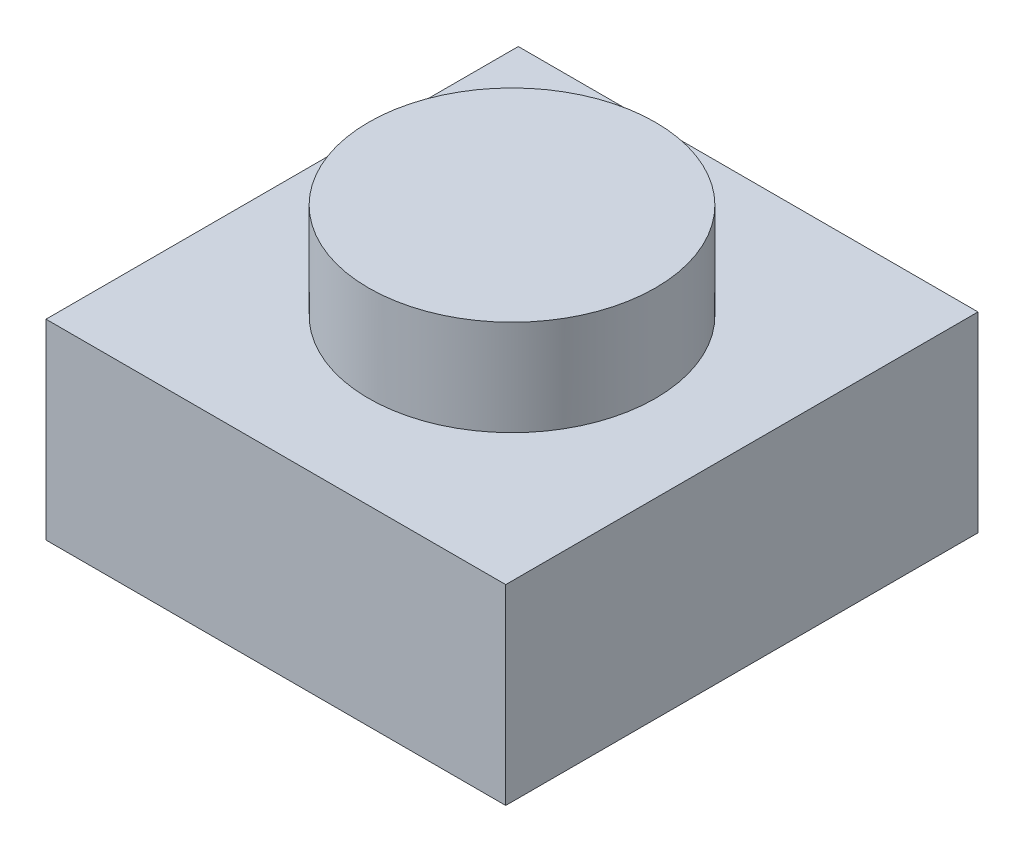
ISO-10303-21;
HEADER;
FILE_DESCRIPTION(('STEP AP214'),'2;1');
FILE_NAME('part.step','',(''),(''),'','','');
FILE_SCHEMA(('AUTOMOTIVE_DESIGN { 1 0 10303 214 1 1 1 1 }'));
ENDSEC;
DATA;
#1=APPLICATION_CONTEXT('core data for automotive mechanical design processes');
#2=APPLICATION_PROTOCOL_DEFINITION('international standard','automotive_design',2000,#1);
#3=PRODUCT_CONTEXT('',#1,'mechanical');
#4=PRODUCT('Part','Part','',(#3));
#5=PRODUCT_RELATED_PRODUCT_CATEGORY('part','',(#4));
#6=PRODUCT_DEFINITION_FORMATION('','',#4);
#7=PRODUCT_DEFINITION_CONTEXT('part definition',#1,'design');
#8=PRODUCT_DEFINITION('design','',#6,#7);
#9=PRODUCT_DEFINITION_SHAPE('','',#8);
#10=(LENGTH_UNIT() NAMED_UNIT(*) SI_UNIT(.MILLI.,.METRE.));
#11=(NAMED_UNIT(*) PLANE_ANGLE_UNIT() SI_UNIT($,.RADIAN.));
#12=(NAMED_UNIT(*) SI_UNIT($,.STERADIAN.) SOLID_ANGLE_UNIT());
#13=UNCERTAINTY_MEASURE_WITH_UNIT(LENGTH_MEASURE(1.E-05),#10,'distance_accuracy_value','');
#14=(GEOMETRIC_REPRESENTATION_CONTEXT(3) GLOBAL_UNCERTAINTY_ASSIGNED_CONTEXT((#13)) GLOBAL_UNIT_ASSIGNED_CONTEXT((#10,
#11,#12)) REPRESENTATION_CONTEXT('',''));
#15=CARTESIAN_POINT('',(0.,0.,0.));
#16=DIRECTION('',(0.,0.,1.));
#17=DIRECTION('',(1.,0.,0.));
#18=AXIS2_PLACEMENT_3D('',#15,#16,#17);
#19=CARTESIAN_POINT('',(0.,0.,6.7));
#20=DIRECTION('',(0.,0.,1.));
#21=DIRECTION('',(1.,0.,0.));
#22=AXIS2_PLACEMENT_3D('',#19,#20,#21);
#23=PLANE('',#22);
#24=DIRECTION('',(0.,1.,0.));
#25=VECTOR('',#24,1.);
#26=CARTESIAN_POINT('',(1.99527093596059,0.,6.7));
#27=LINE('',#26,#25);
#28=CARTESIAN_POINT('',(1.99527093596059,0.,6.7));
#29=VERTEX_POINT('',#28);
#30=CARTESIAN_POINT('',(1.99527093596058,2.,6.7));
#31=VERTEX_POINT('',#30);
#32=EDGE_CURVE('E171',#29,#31,#27,.T.);
#33=ORIENTED_EDGE('',*,*,#32,.F.);
#34=DIRECTION('',(-1.,0.,0.));
#35=VECTOR('',#34,1.);
#36=CARTESIAN_POINT('',(0.,0.,6.7));
#37=LINE('',#36,#35);
#38=CARTESIAN_POINT('',(-3.24570946774915,0.,6.7));
#39=VERTEX_POINT('',#38);
#40=EDGE_CURVE('E64',#29,#39,#37,.T.);
#41=ORIENTED_EDGE('',*,*,#40,.T.);
#42=DIRECTION('',(0.,-1.,0.));
#43=VECTOR('',#42,1.);
#44=CARTESIAN_POINT('',(-3.24570946774915,2.,6.7));
#45=LINE('',#44,#43);
#46=CARTESIAN_POINT('',(-3.24570946774915,2.,6.7));
#47=VERTEX_POINT('',#46);
#48=EDGE_CURVE('E160',#47,#39,#45,.T.);
#49=ORIENTED_EDGE('',*,*,#48,.F.);
#50=DIRECTION('',(-1.,0.,0.));
#51=VECTOR('',#50,1.);
#52=CARTESIAN_POINT('',(2.89527093596059,2.,6.7));
#53=LINE('',#52,#51);
#54=EDGE_CURVE('E136',#31,#47,#53,.T.);
#55=ORIENTED_EDGE('',*,*,#54,.F.);
#56=EDGE_LOOP('',(#33,#41,#49,#55));
#57=FACE_BOUND('',#56,.T.);
#58=ADVANCED_FACE('F42',(#57),#23,.F.);
#59=CARTESIAN_POINT('',(-12.4847290640394,0.,1.2));
#60=DIRECTION('',(0.,0.,1.));
#61=DIRECTION('',(1.,0.,0.));
#62=AXIS2_PLACEMENT_3D('',#59,#60,#61);
#63=PLANE('',#62);
#64=DIRECTION('',(-1.,0.,0.));
#65=VECTOR('',#64,1.);
#66=CARTESIAN_POINT('',(-12.4847290640394,0.,1.2));
#67=LINE('',#66,#65);
#68=CARTESIAN_POINT('',(1.99527093596059,0.,1.2));
#69=VERTEX_POINT('',#68);
#70=CARTESIAN_POINT('',(-3.24570946774915,0.,1.2));
#71=VERTEX_POINT('',#70);
#72=EDGE_CURVE('E111',#69,#71,#67,.T.);
#73=ORIENTED_EDGE('',*,*,#72,.F.);
#74=DIRECTION('',(0.,1.,0.));
#75=VECTOR('',#74,1.);
#76=CARTESIAN_POINT('',(1.99527093596059,0.,1.2));
#77=LINE('',#76,#75);
#78=CARTESIAN_POINT('',(1.99527093596059,2.,1.2));
#79=VERTEX_POINT('',#78);
#80=EDGE_CURVE('E167',#69,#79,#77,.T.);
#81=ORIENTED_EDGE('',*,*,#80,.T.);
#82=DIRECTION('',(1.,0.,0.));
#83=VECTOR('',#82,1.);
#84=CARTESIAN_POINT('',(-12.4847290640394,2.,1.2));
#85=LINE('',#84,#83);
#86=CARTESIAN_POINT('',(-3.24570946774915,2.,1.2));
#87=VERTEX_POINT('',#86);
#88=EDGE_CURVE('E128',#87,#79,#85,.T.);
#89=ORIENTED_EDGE('',*,*,#88,.F.);
#90=DIRECTION('',(0.,-1.,0.));
#91=VECTOR('',#90,1.);
#92=CARTESIAN_POINT('',(-3.24570946774915,2.,1.2));
#93=LINE('',#92,#91);
#94=EDGE_CURVE('E164',#87,#71,#93,.T.);
#95=ORIENTED_EDGE('',*,*,#94,.T.);
#96=EDGE_LOOP('',(#73,#81,#89,#95));
#97=FACE_BOUND('',#96,.T.);
#98=ADVANCED_FACE('F151',(#97),#63,.T.);
#99=CARTESIAN_POINT('',(2.89527093596059,3.2,7.9));
#100=DIRECTION('',(0.,-1.,0.));
#101=DIRECTION('',(1.,0.,0.));
#102=AXIS2_PLACEMENT_3D('',#99,#100,#101);
#103=PLANE('',#102);
#104=CARTESIAN_POINT('',(-0.614730354205517,3.2,3.95));
#105=DIRECTION('',(0.,-1.,0.));
#106=DIRECTION('',(1.,0.,0.));
#107=AXIS2_PLACEMENT_3D('',#104,#105,#106);
#108=CIRCLE('',#107,2.4);
#109=CARTESIAN_POINT('',(1.78526964579448,3.2,3.95));
#110=VERTEX_POINT('',#109);
#111=EDGE_CURVE('E50',#110,#110,#108,.F.);
#112=ORIENTED_EDGE('',*,*,#111,.F.);
#113=EDGE_LOOP('',(#112));
#114=FACE_BOUND('',#113,.T.);
#115=DIRECTION('',(1.,0.,0.));
#116=VECTOR('',#115,1.);
#117=CARTESIAN_POINT('',(-12.4847290640394,3.2,0.));
#118=LINE('',#117,#116);
#119=CARTESIAN_POINT('',(-4.45973164437162,3.2,0.));
#120=VERTEX_POINT('',#119);
#121=CARTESIAN_POINT('',(3.23027093596058,3.2,0.));
#122=VERTEX_POINT('',#121);
#123=EDGE_CURVE('E139',#120,#122,#118,.T.);
#124=ORIENTED_EDGE('',*,*,#123,.F.);
#125=DIRECTION('',(0.,0.,1.));
#126=VECTOR('',#125,1.);
#127=CARTESIAN_POINT('',(-4.45973164437162,3.2,0.));
#128=LINE('',#127,#126);
#129=CARTESIAN_POINT('',(-4.45973164437162,3.2,7.9));
#130=VERTEX_POINT('',#129);
#131=EDGE_CURVE('E124',#120,#130,#128,.T.);
#132=ORIENTED_EDGE('',*,*,#131,.T.);
#133=DIRECTION('',(-1.,0.,0.));
#134=VECTOR('',#133,1.);
#135=CARTESIAN_POINT('',(2.89527093596059,3.2,7.9));
#136=LINE('',#135,#134);
#137=CARTESIAN_POINT('',(3.23027093596058,3.2,7.9));
#138=VERTEX_POINT('',#137);
#139=EDGE_CURVE('E141',#138,#130,#136,.T.);
#140=ORIENTED_EDGE('',*,*,#139,.F.);
#141=DIRECTION('',(0.,0.,-1.));
#142=VECTOR('',#141,1.);
#143=CARTESIAN_POINT('',(3.23027093596058,3.2,7.9));
#144=LINE('',#143,#142);
#145=EDGE_CURVE('E155',#138,#122,#144,.T.);
#146=ORIENTED_EDGE('',*,*,#145,.T.);
#147=EDGE_LOOP('',(#124,#132,#140,#146));
#148=FACE_BOUND('',#147,.T.);
#149=ADVANCED_FACE('F44',(#114,#148),#103,.F.);
#150=CARTESIAN_POINT('',(0.,0.,7.9));
#151=DIRECTION('',(0.,0.,1.));
#152=DIRECTION('',(1.,0.,0.));
#153=AXIS2_PLACEMENT_3D('',#150,#151,#152);
#154=PLANE('',#153);
#155=DIRECTION('',(-1.,0.,0.));
#156=VECTOR('',#155,1.);
#157=CARTESIAN_POINT('',(-4.45973164437162,0.,7.9));
#158=LINE('',#157,#156);
#159=CARTESIAN_POINT('',(3.23027093596058,0.,7.9));
#160=VERTEX_POINT('',#159);
#161=CARTESIAN_POINT('',(-4.45973164437162,0.,7.9));
#162=VERTEX_POINT('',#161);
#163=EDGE_CURVE('E107',#160,#162,#158,.T.);
#164=ORIENTED_EDGE('',*,*,#163,.F.);
#165=DIRECTION('',(0.,1.,0.));
#166=VECTOR('',#165,1.);
#167=CARTESIAN_POINT('',(3.23027093596058,3.2,7.9));
#168=LINE('',#167,#166);
#169=EDGE_CURVE('E158',#160,#138,#168,.T.);
#170=ORIENTED_EDGE('',*,*,#169,.T.);
#171=ORIENTED_EDGE('',*,*,#139,.T.);
#172=DIRECTION('',(0.,1.,0.));
#173=VECTOR('',#172,1.);
#174=CARTESIAN_POINT('',(-4.45973164437162,3.2,7.9));
#175=LINE('',#174,#173);
#176=EDGE_CURVE('E126',#162,#130,#175,.T.);
#177=ORIENTED_EDGE('',*,*,#176,.F.);
#178=EDGE_LOOP('',(#164,#170,#171,#177));
#179=FACE_BOUND('',#178,.T.);
#180=ADVANCED_FACE('F150',(#179),#154,.T.);
#181=CARTESIAN_POINT('',(-12.4847290640394,0.,0.));
#182=DIRECTION('',(0.,0.,1.));
#183=DIRECTION('',(1.,0.,0.));
#184=AXIS2_PLACEMENT_3D('',#181,#182,#183);
#185=PLANE('',#184);
#186=DIRECTION('',(0.,1.,0.));
#187=VECTOR('',#186,1.);
#188=CARTESIAN_POINT('',(3.23027093596058,3.2,0.));
#189=LINE('',#188,#187);
#190=CARTESIAN_POINT('',(3.23027093596058,0.,0.));
#191=VERTEX_POINT('',#190);
#192=EDGE_CURVE('E120',#191,#122,#189,.T.);
#193=ORIENTED_EDGE('',*,*,#192,.F.);
#194=DIRECTION('',(-1.,0.,0.));
#195=VECTOR('',#194,1.);
#196=CARTESIAN_POINT('',(-4.45973164437162,0.,0.));
#197=LINE('',#196,#195);
#198=CARTESIAN_POINT('',(-4.45973164437162,0.,0.));
#199=VERTEX_POINT('',#198);
#200=EDGE_CURVE('E57',#191,#199,#197,.T.);
#201=ORIENTED_EDGE('',*,*,#200,.T.);
#202=DIRECTION('',(0.,1.,0.));
#203=VECTOR('',#202,1.);
#204=CARTESIAN_POINT('',(-4.45973164437162,3.2,0.));
#205=LINE('',#204,#203);
#206=EDGE_CURVE('E118',#199,#120,#205,.T.);
#207=ORIENTED_EDGE('',*,*,#206,.T.);
#208=ORIENTED_EDGE('',*,*,#123,.T.);
#209=EDGE_LOOP('',(#193,#201,#207,#208));
#210=FACE_BOUND('',#209,.T.);
#211=ADVANCED_FACE('F116',(#210),#185,.F.);
#212=CARTESIAN_POINT('',(2.89527093596059,2.,7.9));
#213=DIRECTION('',(0.,-1.,0.));
#214=DIRECTION('',(1.,0.,0.));
#215=AXIS2_PLACEMENT_3D('',#212,#213,#214);
#216=PLANE('',#215);
#217=DIRECTION('',(0.,0.,1.));
#218=VECTOR('',#217,1.);
#219=CARTESIAN_POINT('',(-3.24570946774915,2.,1.2));
#220=LINE('',#219,#218);
#221=EDGE_CURVE('E165',#87,#47,#220,.T.);
#222=ORIENTED_EDGE('',*,*,#221,.F.);
#223=ORIENTED_EDGE('',*,*,#88,.T.);
#224=DIRECTION('',(0.,0.,1.));
#225=VECTOR('',#224,1.);
#226=CARTESIAN_POINT('',(1.99527093596059,2.,1.2));
#227=LINE('',#226,#225);
#228=EDGE_CURVE('E173',#79,#31,#227,.T.);
#229=ORIENTED_EDGE('',*,*,#228,.T.);
#230=ORIENTED_EDGE('',*,*,#54,.T.);
#231=EDGE_LOOP('',(#222,#223,#229,#230));
#232=FACE_BOUND('',#231,.T.);
#233=ADVANCED_FACE('F196',(#232),#216,.T.);
#234=CARTESIAN_POINT('',(-4.45973164437162,3.2,0.));
#235=DIRECTION('',(1.,0.,0.));
#236=DIRECTION('',(0.,0.,-1.));
#237=AXIS2_PLACEMENT_3D('',#234,#235,#236);
#238=PLANE('',#237);
#239=ORIENTED_EDGE('',*,*,#206,.F.);
#240=DIRECTION('',(0.,0.,1.));
#241=VECTOR('',#240,1.);
#242=CARTESIAN_POINT('',(-4.45973164437162,0.,0.));
#243=LINE('',#242,#241);
#244=EDGE_CURVE('E104',#199,#162,#243,.T.);
#245=ORIENTED_EDGE('',*,*,#244,.T.);
#246=ORIENTED_EDGE('',*,*,#176,.T.);
#247=ORIENTED_EDGE('',*,*,#131,.F.);
#248=EDGE_LOOP('',(#239,#245,#246,#247));
#249=FACE_BOUND('',#248,.T.);
#250=ADVANCED_FACE('F122',(#249),#238,.F.);
#251=CARTESIAN_POINT('',(3.23027093596058,3.2,7.9));
#252=DIRECTION('',(-1.,0.,0.));
#253=DIRECTION('',(0.,-1.,0.));
#254=AXIS2_PLACEMENT_3D('',#251,#252,#253);
#255=PLANE('',#254);
#256=ORIENTED_EDGE('',*,*,#169,.F.);
#257=DIRECTION('',(0.,0.,1.));
#258=VECTOR('',#257,1.);
#259=CARTESIAN_POINT('',(3.23027093596058,0.,0.));
#260=LINE('',#259,#258);
#261=EDGE_CURVE('E112',#191,#160,#260,.T.);
#262=ORIENTED_EDGE('',*,*,#261,.F.);
#263=ORIENTED_EDGE('',*,*,#192,.T.);
#264=ORIENTED_EDGE('',*,*,#145,.F.);
#265=EDGE_LOOP('',(#256,#262,#263,#264));
#266=FACE_BOUND('',#265,.T.);
#267=ADVANCED_FACE('F185',(#266),#255,.F.);
#268=CARTESIAN_POINT('',(-3.24570946774915,2.,1.2));
#269=DIRECTION('',(1.,0.,0.));
#270=DIRECTION('',(0.,0.,-1.));
#271=AXIS2_PLACEMENT_3D('',#268,#269,#270);
#272=PLANE('',#271);
#273=DIRECTION('',(0.,0.,1.));
#274=VECTOR('',#273,1.);
#275=CARTESIAN_POINT('',(-3.24570946774915,0.,1.2));
#276=LINE('',#275,#274);
#277=EDGE_CURVE('E179',#71,#39,#276,.T.);
#278=ORIENTED_EDGE('',*,*,#277,.F.);
#279=ORIENTED_EDGE('',*,*,#94,.F.);
#280=ORIENTED_EDGE('',*,*,#221,.T.);
#281=ORIENTED_EDGE('',*,*,#48,.T.);
#282=EDGE_LOOP('',(#278,#279,#280,#281));
#283=FACE_BOUND('',#282,.T.);
#284=ADVANCED_FACE('F187',(#283),#272,.T.);
#285=CARTESIAN_POINT('',(1.99527093596059,0.,1.2));
#286=DIRECTION('',(-1.,0.,0.));
#287=DIRECTION('',(0.,-1.,0.));
#288=AXIS2_PLACEMENT_3D('',#285,#286,#287);
#289=PLANE('',#288);
#290=DIRECTION('',(0.,0.,-1.));
#291=VECTOR('',#290,1.);
#292=CARTESIAN_POINT('',(1.99527093596059,0.,1.2));
#293=LINE('',#292,#291);
#294=EDGE_CURVE('E12',#29,#69,#293,.T.);
#295=ORIENTED_EDGE('',*,*,#294,.F.);
#296=ORIENTED_EDGE('',*,*,#32,.T.);
#297=ORIENTED_EDGE('',*,*,#228,.F.);
#298=ORIENTED_EDGE('',*,*,#80,.F.);
#299=EDGE_LOOP('',(#295,#296,#297,#298));
#300=FACE_BOUND('',#299,.T.);
#301=ADVANCED_FACE('F193',(#300),#289,.T.);
#302=CARTESIAN_POINT('',(-0.614730354205517,4.8,3.95));
#303=DIRECTION('',(0.,1.,0.));
#304=DIRECTION('',(-1.,0.,0.));
#305=AXIS2_PLACEMENT_3D('',#302,#303,#304);
#306=PLANE('',#305);
#307=CARTESIAN_POINT('',(-0.614730354205517,4.8,3.95));
#308=DIRECTION('',(0.,1.,0.));
#309=DIRECTION('',(-1.,0.,0.));
#310=AXIS2_PLACEMENT_3D('',#307,#308,#309);
#311=CIRCLE('',#310,2.4);
#312=CARTESIAN_POINT('',(-3.01473035420552,4.8,3.95));
#313=VERTEX_POINT('',#312);
#314=EDGE_CURVE('E176',#313,#313,#311,.T.);
#315=ORIENTED_EDGE('',*,*,#314,.T.);
#316=EDGE_LOOP('',(#315));
#317=FACE_BOUND('',#316,.T.);
#318=ADVANCED_FACE('F268',(#317),#306,.T.);
#319=CARTESIAN_POINT('',(-0.614730354205517,4.8,3.95));
#320=DIRECTION('',(0.,-1.,0.));
#321=DIRECTION('',(1.,0.,0.));
#322=AXIS2_PLACEMENT_3D('',#319,#320,#321);
#323=CYLINDRICAL_SURFACE('',#322,2.4);
#324=ORIENTED_EDGE('',*,*,#314,.F.);
#325=EDGE_LOOP('',(#324));
#326=FACE_BOUND('',#325,.T.);
#327=ORIENTED_EDGE('',*,*,#111,.T.);
#328=EDGE_LOOP('',(#327));
#329=FACE_BOUND('',#328,.T.);
#330=ADVANCED_FACE('F146',(#326,#329),#323,.T.);
#331=CARTESIAN_POINT('',(-4.45973164437162,0.,0.));
#332=DIRECTION('',(0.,1.,0.));
#333=DIRECTION('',(-1.,0.,0.));
#334=AXIS2_PLACEMENT_3D('',#331,#332,#333);
#335=PLANE('',#334);
#336=ORIENTED_EDGE('',*,*,#277,.T.);
#337=ORIENTED_EDGE('',*,*,#40,.F.);
#338=ORIENTED_EDGE('',*,*,#294,.T.);
#339=ORIENTED_EDGE('',*,*,#72,.T.);
#340=EDGE_LOOP('',(#336,#337,#338,#339));
#341=FACE_BOUND('',#340,.T.);
#342=ORIENTED_EDGE('',*,*,#163,.T.);
#343=ORIENTED_EDGE('',*,*,#244,.F.);
#344=ORIENTED_EDGE('',*,*,#200,.F.);
#345=ORIENTED_EDGE('',*,*,#261,.T.);
#346=EDGE_LOOP('',(#342,#343,#344,#345));
#347=FACE_BOUND('',#346,.T.);
#348=ADVANCED_FACE('F105',(#341,#347),#335,.F.);
#349=CLOSED_SHELL('',(#58,#98,#149,#180,#211,#233,#250,#267,#284,#301,#318,#330,#348));
#350=MANIFOLD_SOLID_BREP('B2',#349);
#351=ADVANCED_BREP_SHAPE_REPRESENTATION('',(#18,#350),#14);
#352=SHAPE_DEFINITION_REPRESENTATION(#9,#351);
ENDSEC;
END-ISO-10303-21;
